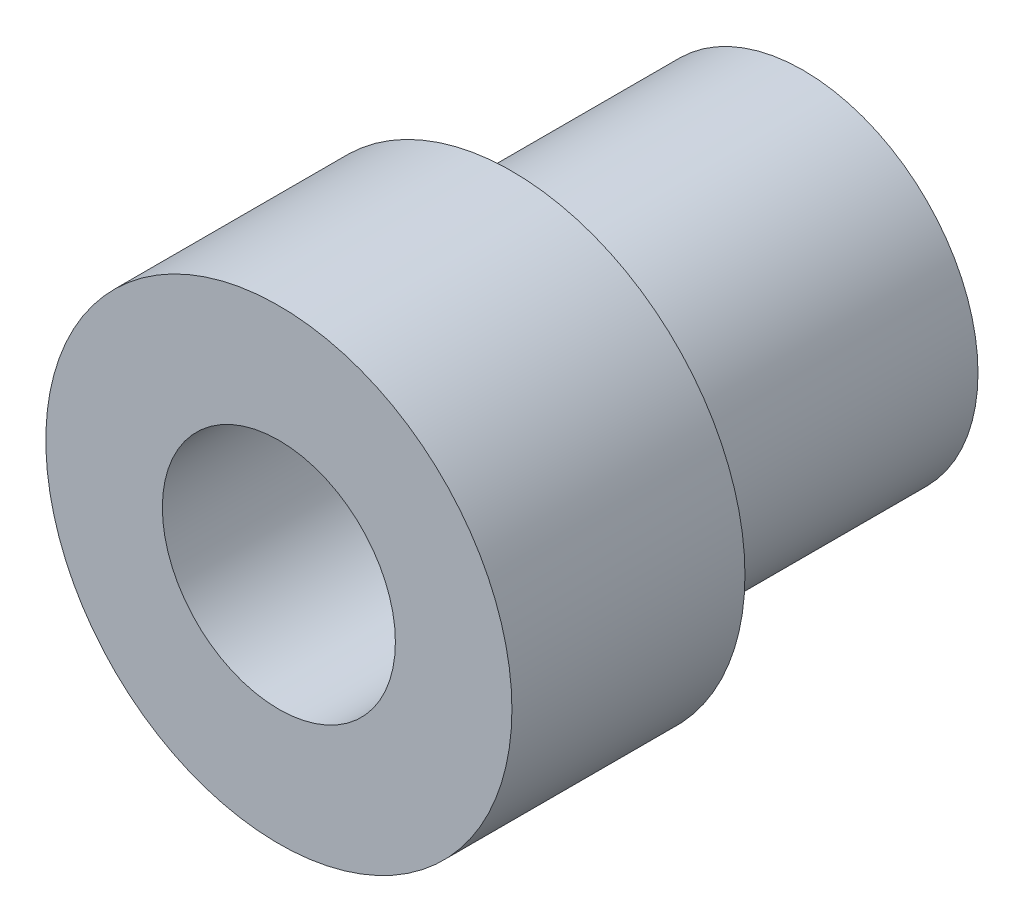
ISO-10303-21;
HEADER;
FILE_DESCRIPTION(('STEP AP214'),'2;1');
FILE_NAME('part.step','',(''),(''),'','','');
FILE_SCHEMA(('AUTOMOTIVE_DESIGN { 1 0 10303 214 1 1 1 1 }'));
ENDSEC;
DATA;
#1=APPLICATION_CONTEXT('core data for automotive mechanical design processes');
#2=APPLICATION_PROTOCOL_DEFINITION('international standard','automotive_design',2000,#1);
#3=PRODUCT_CONTEXT('',#1,'mechanical');
#4=PRODUCT('Part','Part','',(#3));
#5=PRODUCT_RELATED_PRODUCT_CATEGORY('part','',(#4));
#6=PRODUCT_DEFINITION_FORMATION('','',#4);
#7=PRODUCT_DEFINITION_CONTEXT('part definition',#1,'design');
#8=PRODUCT_DEFINITION('design','',#6,#7);
#9=PRODUCT_DEFINITION_SHAPE('','',#8);
#10=(LENGTH_UNIT() NAMED_UNIT(*) SI_UNIT(.MILLI.,.METRE.));
#11=(NAMED_UNIT(*) PLANE_ANGLE_UNIT() SI_UNIT($,.RADIAN.));
#12=(NAMED_UNIT(*) SI_UNIT($,.STERADIAN.) SOLID_ANGLE_UNIT());
#13=UNCERTAINTY_MEASURE_WITH_UNIT(LENGTH_MEASURE(1.E-05),#10,'distance_accuracy_value','');
#14=(GEOMETRIC_REPRESENTATION_CONTEXT(3) GLOBAL_UNCERTAINTY_ASSIGNED_CONTEXT((#13)) GLOBAL_UNIT_ASSIGNED_CONTEXT((#10,
#11,#12)) REPRESENTATION_CONTEXT('',''));
#15=CARTESIAN_POINT('',(0.,0.,0.));
#16=DIRECTION('',(0.,0.,1.));
#17=DIRECTION('',(1.,0.,0.));
#18=AXIS2_PLACEMENT_3D('',#15,#16,#17);
#19=CARTESIAN_POINT('',(0.,0.,0.));
#20=DIRECTION('',(0.,0.,1.));
#21=DIRECTION('',(1.,0.,0.));
#22=AXIS2_PLACEMENT_3D('',#19,#20,#21);
#23=PLANE('',#22);
#24=CARTESIAN_POINT('',(0.,0.,0.));
#25=DIRECTION('',(0.,0.,1.));
#26=DIRECTION('',(1.,0.,0.));
#27=AXIS2_PLACEMENT_3D('',#24,#25,#26);
#28=CIRCLE('',#27,6.35);
#29=CARTESIAN_POINT('',(6.35,0.,0.));
#30=VERTEX_POINT('',#29);
#31=EDGE_CURVE('E43',#30,#30,#28,.T.);
#32=ORIENTED_EDGE('',*,*,#31,.F.);
#33=EDGE_LOOP('',(#32));
#34=FACE_BOUND('',#33,.T.);
#35=CARTESIAN_POINT('',(0.,0.,0.));
#36=DIRECTION('',(0.,0.,1.));
#37=DIRECTION('',(1.,0.,0.));
#38=AXIS2_PLACEMENT_3D('',#35,#36,#37);
#39=CIRCLE('',#38,4.7625);
#40=CARTESIAN_POINT('',(4.7625,0.,0.));
#41=VERTEX_POINT('',#40);
#42=EDGE_CURVE('E10',#41,#41,#39,.F.);
#43=ORIENTED_EDGE('',*,*,#42,.F.);
#44=EDGE_LOOP('',(#43));
#45=FACE_BOUND('',#44,.T.);
#46=ADVANCED_FACE('F32',(#34,#45),#23,.F.);
#47=CARTESIAN_POINT('',(0.,0.,6.35));
#48=DIRECTION('',(0.,0.,-1.));
#49=DIRECTION('',(-1.,0.,0.));
#50=AXIS2_PLACEMENT_3D('',#47,#48,#49);
#51=CYLINDRICAL_SURFACE('',#50,6.35);
#52=CARTESIAN_POINT('',(0.,0.,6.35));
#53=DIRECTION('',(0.,0.,1.));
#54=DIRECTION('',(1.,0.,0.));
#55=AXIS2_PLACEMENT_3D('',#52,#53,#54);
#56=CIRCLE('',#55,6.35);
#57=CARTESIAN_POINT('',(6.35,0.,6.35));
#58=VERTEX_POINT('',#57);
#59=EDGE_CURVE('E39',#58,#58,#56,.T.);
#60=ORIENTED_EDGE('',*,*,#59,.F.);
#61=EDGE_LOOP('',(#60));
#62=FACE_BOUND('',#61,.T.);
#63=ORIENTED_EDGE('',*,*,#31,.T.);
#64=EDGE_LOOP('',(#63));
#65=FACE_BOUND('',#64,.T.);
#66=ADVANCED_FACE('F34',(#62,#65),#51,.T.);
#67=CARTESIAN_POINT('',(0.,0.,6.35));
#68=DIRECTION('',(0.,0.,1.));
#69=DIRECTION('',(1.,0.,0.));
#70=AXIS2_PLACEMENT_3D('',#67,#68,#69);
#71=PLANE('',#70);
#72=CARTESIAN_POINT('',(0.,0.,6.35));
#73=DIRECTION('',(0.,0.,1.));
#74=DIRECTION('',(1.,0.,0.));
#75=AXIS2_PLACEMENT_3D('',#72,#73,#74);
#76=CIRCLE('',#75,3.175);
#77=CARTESIAN_POINT('',(3.175,0.,6.35));
#78=VERTEX_POINT('',#77);
#79=EDGE_CURVE('E52',#78,#78,#76,.F.);
#80=ORIENTED_EDGE('',*,*,#79,.T.);
#81=EDGE_LOOP('',(#80));
#82=FACE_BOUND('',#81,.T.);
#83=ORIENTED_EDGE('',*,*,#59,.T.);
#84=EDGE_LOOP('',(#83));
#85=FACE_BOUND('',#84,.T.);
#86=ADVANCED_FACE('F70',(#82,#85),#71,.T.);
#87=CARTESIAN_POINT('',(0.,0.,-7.9375));
#88=DIRECTION('',(0.,0.,1.));
#89=DIRECTION('',(1.,0.,0.));
#90=AXIS2_PLACEMENT_3D('',#87,#88,#89);
#91=CYLINDRICAL_SURFACE('',#90,4.7625);
#92=CARTESIAN_POINT('',(0.,0.,-7.9375));
#93=DIRECTION('',(0.,0.,-1.));
#94=DIRECTION('',(-1.,0.,0.));
#95=AXIS2_PLACEMENT_3D('',#92,#93,#94);
#96=CIRCLE('',#95,4.7625);
#97=CARTESIAN_POINT('',(-4.7625,0.,-7.9375));
#98=VERTEX_POINT('',#97);
#99=EDGE_CURVE('E48',#98,#98,#96,.T.);
#100=ORIENTED_EDGE('',*,*,#99,.F.);
#101=EDGE_LOOP('',(#100));
#102=FACE_BOUND('',#101,.T.);
#103=ORIENTED_EDGE('',*,*,#42,.T.);
#104=EDGE_LOOP('',(#103));
#105=FACE_BOUND('',#104,.T.);
#106=ADVANCED_FACE('F65',(#102,#105),#91,.T.);
#107=CARTESIAN_POINT('',(0.,0.,-7.9375));
#108=DIRECTION('',(0.,0.,-1.));
#109=DIRECTION('',(-1.,0.,0.));
#110=AXIS2_PLACEMENT_3D('',#107,#108,#109);
#111=PLANE('',#110);
#112=CARTESIAN_POINT('',(0.,0.,-7.9375));
#113=DIRECTION('',(0.,0.,-1.));
#114=DIRECTION('',(-1.,0.,0.));
#115=AXIS2_PLACEMENT_3D('',#112,#113,#114);
#116=CIRCLE('',#115,3.175);
#117=CARTESIAN_POINT('',(-3.175,0.,-7.9375));
#118=VERTEX_POINT('',#117);
#119=EDGE_CURVE('E55',#118,#118,#116,.T.);
#120=ORIENTED_EDGE('',*,*,#119,.F.);
#121=EDGE_LOOP('',(#120));
#122=FACE_BOUND('',#121,.T.);
#123=ORIENTED_EDGE('',*,*,#99,.T.);
#124=EDGE_LOOP('',(#123));
#125=FACE_BOUND('',#124,.T.);
#126=ADVANCED_FACE('F62',(#122,#125),#111,.T.);
#127=CARTESIAN_POINT('',(0.,0.,15.3302561210692));
#128=DIRECTION('',(0.,0.,-1.));
#129=DIRECTION('',(-1.,0.,0.));
#130=AXIS2_PLACEMENT_3D('',#127,#128,#129);
#131=CYLINDRICAL_SURFACE('',#130,3.175);
#132=ORIENTED_EDGE('',*,*,#119,.T.);
#133=EDGE_LOOP('',(#132));
#134=FACE_BOUND('',#133,.T.);
#135=ORIENTED_EDGE('',*,*,#79,.F.);
#136=EDGE_LOOP('',(#135));
#137=FACE_BOUND('',#136,.T.);
#138=ADVANCED_FACE('F59',(#134,#137),#131,.F.);
#139=CLOSED_SHELL('',(#46,#66,#86,#106,#126,#138));
#140=MANIFOLD_SOLID_BREP('B2',#139);
#141=ADVANCED_BREP_SHAPE_REPRESENTATION('',(#18,#140),#14);
#142=SHAPE_DEFINITION_REPRESENTATION(#9,#141);
ENDSEC;
END-ISO-10303-21;
